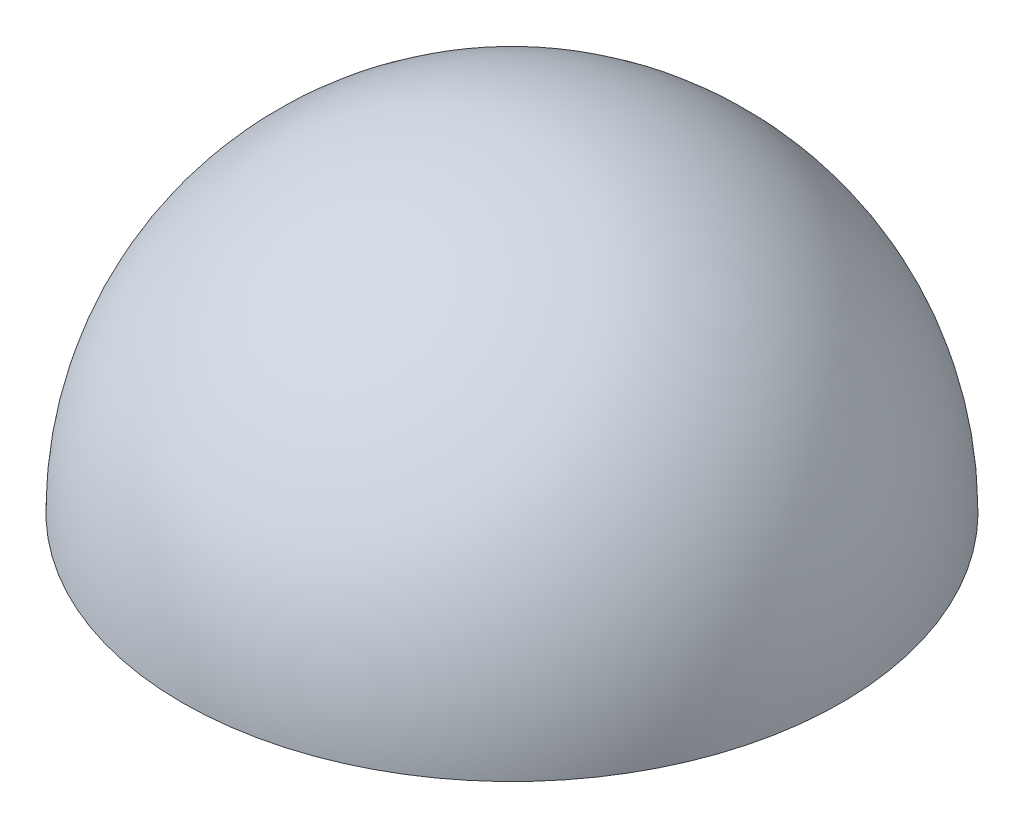
ISO-10303-21;
HEADER;
FILE_DESCRIPTION(('STEP AP214'),'2;1');
FILE_NAME('part.step','',(''),(''),'','','');
FILE_SCHEMA(('AUTOMOTIVE_DESIGN { 1 0 10303 214 1 1 1 1 }'));
ENDSEC;
DATA;
#1=APPLICATION_CONTEXT('core data for automotive mechanical design processes');
#2=APPLICATION_PROTOCOL_DEFINITION('international standard','automotive_design',2000,#1);
#3=PRODUCT_CONTEXT('',#1,'mechanical');
#4=PRODUCT('Part','Part','',(#3));
#5=PRODUCT_RELATED_PRODUCT_CATEGORY('part','',(#4));
#6=PRODUCT_DEFINITION_FORMATION('','',#4);
#7=PRODUCT_DEFINITION_CONTEXT('part definition',#1,'design');
#8=PRODUCT_DEFINITION('design','',#6,#7);
#9=PRODUCT_DEFINITION_SHAPE('','',#8);
#10=(LENGTH_UNIT() NAMED_UNIT(*) SI_UNIT(.MILLI.,.METRE.));
#11=(NAMED_UNIT(*) PLANE_ANGLE_UNIT() SI_UNIT($,.RADIAN.));
#12=(NAMED_UNIT(*) SI_UNIT($,.STERADIAN.) SOLID_ANGLE_UNIT());
#13=UNCERTAINTY_MEASURE_WITH_UNIT(LENGTH_MEASURE(1.E-05),#10,'distance_accuracy_value','');
#14=(GEOMETRIC_REPRESENTATION_CONTEXT(3) GLOBAL_UNCERTAINTY_ASSIGNED_CONTEXT((#13)) GLOBAL_UNIT_ASSIGNED_CONTEXT((#10,
#11,#12)) REPRESENTATION_CONTEXT('',''));
#15=CARTESIAN_POINT('',(0.,0.,0.));
#16=DIRECTION('',(0.,0.,1.));
#17=DIRECTION('',(1.,0.,0.));
#18=AXIS2_PLACEMENT_3D('',#15,#16,#17);
#19=CARTESIAN_POINT('',(0.,0.,0.));
#20=DIRECTION('',(0.,1.,0.));
#21=DIRECTION('',(0.,0.,1.));
#22=AXIS2_PLACEMENT_3D('',#19,#20,#21);
#23=SPHERICAL_SURFACE('',#22,6.55);
#24=CARTESIAN_POINT('',(0.,0.,0.));
#25=DIRECTION('',(0.,1.,0.));
#26=DIRECTION('',(0.,0.,1.));
#27=AXIS2_PLACEMENT_3D('',#24,#25,#26);
#28=CIRCLE('',#27,6.55);
#29=CARTESIAN_POINT('',(0.,0.,6.55));
#30=VERTEX_POINT('',#29);
#31=EDGE_CURVE('E45',#30,#30,#28,.T.);
#32=ORIENTED_EDGE('',*,*,#31,.F.);
#33=EDGE_LOOP('',(#32));
#34=FACE_BOUND('',#33,.T.);
#35=CARTESIAN_POINT('',(0.,5.5,0.));
#36=DIRECTION('',(0.,1.,0.));
#37=DIRECTION('',(0.,0.,1.));
#38=AXIS2_PLACEMENT_3D('',#35,#36,#37);
#39=CIRCLE('',#38,3.55703528236648);
#40=CARTESIAN_POINT('',(0.,5.5,3.55703528236648));
#41=VERTEX_POINT('',#40);
#42=EDGE_CURVE('E11',#41,#41,#39,.F.);
#43=ORIENTED_EDGE('',*,*,#42,.F.);
#44=EDGE_LOOP('',(#43));
#45=FACE_BOUND('',#44,.T.);
#46=ADVANCED_FACE('F34',(#34,#45),#23,.F.);
#47=CARTESIAN_POINT('',(0.,0.,0.));
#48=DIRECTION('',(0.,1.,0.));
#49=DIRECTION('',(0.,0.,1.));
#50=AXIS2_PLACEMENT_3D('',#47,#48,#49);
#51=PLANE('',#50);
#52=ORIENTED_EDGE('',*,*,#31,.T.);
#53=EDGE_LOOP('',(#52));
#54=FACE_BOUND('',#53,.T.);
#55=CARTESIAN_POINT('',(0.,0.,0.));
#56=DIRECTION('',(0.,1.,0.));
#57=DIRECTION('',(0.,0.,1.));
#58=AXIS2_PLACEMENT_3D('',#55,#56,#57);
#59=CIRCLE('',#58,7.);
#60=CARTESIAN_POINT('',(0.,0.,7.));
#61=VERTEX_POINT('',#60);
#62=EDGE_CURVE('E41',#61,#61,#59,.T.);
#63=ORIENTED_EDGE('',*,*,#62,.F.);
#64=EDGE_LOOP('',(#63));
#65=FACE_BOUND('',#64,.T.);
#66=ADVANCED_FACE('F52',(#54,#65),#51,.F.);
#67=CARTESIAN_POINT('',(0.,0.,0.));
#68=DIRECTION('',(0.,1.,0.));
#69=DIRECTION('',(0.,0.,1.));
#70=AXIS2_PLACEMENT_3D('',#67,#68,#69);
#71=SPHERICAL_SURFACE('',#70,7.);
#72=ORIENTED_EDGE('',*,*,#62,.T.);
#73=EDGE_LOOP('',(#72));
#74=FACE_BOUND('',#73,.T.);
#75=ADVANCED_FACE('F36',(#74),#71,.T.);
#76=CARTESIAN_POINT('',(0.,5.5,0.));
#77=DIRECTION('',(0.,1.,0.));
#78=DIRECTION('',(0.,0.,1.));
#79=AXIS2_PLACEMENT_3D('',#76,#77,#78);
#80=PLANE('',#79);
#81=ORIENTED_EDGE('',*,*,#42,.T.);
#82=EDGE_LOOP('',(#81));
#83=FACE_BOUND('',#82,.T.);
#84=ADVANCED_FACE('F64',(#83),#80,.F.);
#85=CLOSED_SHELL('',(#46,#66,#75,#84));
#86=MANIFOLD_SOLID_BREP('B2',#85);
#87=ADVANCED_BREP_SHAPE_REPRESENTATION('',(#18,#86),#14);
#88=SHAPE_DEFINITION_REPRESENTATION(#9,#87);
ENDSEC;
END-ISO-10303-21;
